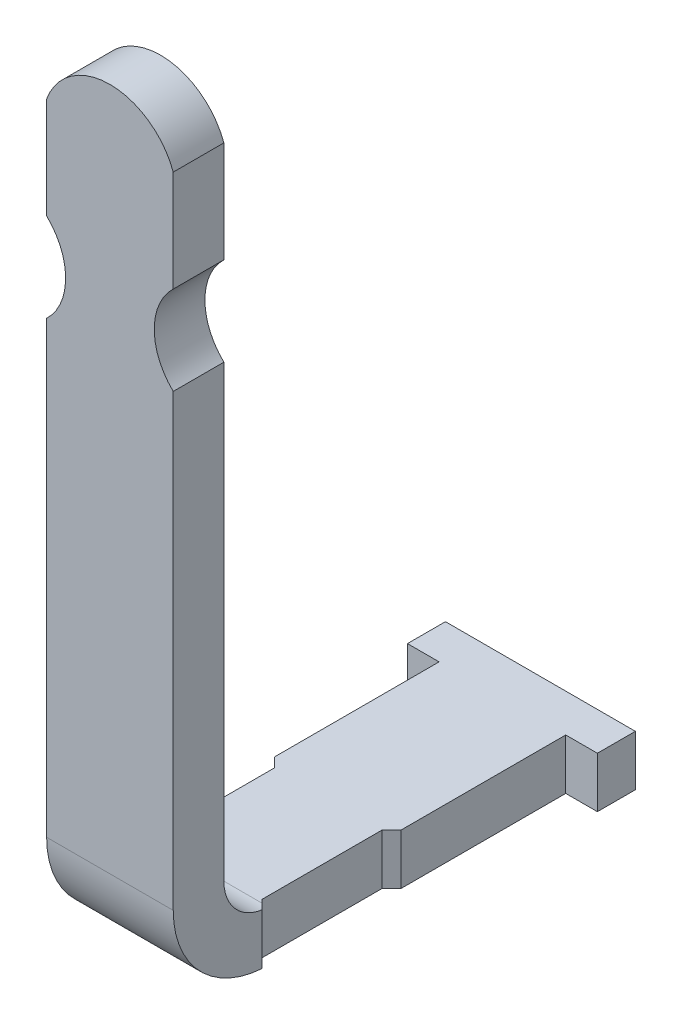
ISO-10303-21;
HEADER;
FILE_DESCRIPTION(('STEP AP214'),'2;1');
FILE_NAME('part.step','',(''),(''),'','','');
FILE_SCHEMA(('AUTOMOTIVE_DESIGN { 1 0 10303 214 1 1 1 1 }'));
ENDSEC;
DATA;
#1=APPLICATION_CONTEXT('core data for automotive mechanical design processes');
#2=APPLICATION_PROTOCOL_DEFINITION('international standard','automotive_design',2000,#1);
#3=PRODUCT_CONTEXT('',#1,'mechanical');
#4=PRODUCT('Part','Part','',(#3));
#5=PRODUCT_RELATED_PRODUCT_CATEGORY('part','',(#4));
#6=PRODUCT_DEFINITION_FORMATION('','',#4);
#7=PRODUCT_DEFINITION_CONTEXT('part definition',#1,'design');
#8=PRODUCT_DEFINITION('design','',#6,#7);
#9=PRODUCT_DEFINITION_SHAPE('','',#8);
#10=(LENGTH_UNIT() NAMED_UNIT(*) SI_UNIT(.MILLI.,.METRE.));
#11=(NAMED_UNIT(*) PLANE_ANGLE_UNIT() SI_UNIT($,.RADIAN.));
#12=(NAMED_UNIT(*) SI_UNIT($,.STERADIAN.) SOLID_ANGLE_UNIT());
#13=UNCERTAINTY_MEASURE_WITH_UNIT(LENGTH_MEASURE(1.E-05),#10,'distance_accuracy_value','');
#14=(GEOMETRIC_REPRESENTATION_CONTEXT(3) GLOBAL_UNCERTAINTY_ASSIGNED_CONTEXT((#13)) GLOBAL_UNIT_ASSIGNED_CONTEXT((#10,
#11,#12)) REPRESENTATION_CONTEXT('',''));
#15=CARTESIAN_POINT('',(0.,0.,0.));
#16=DIRECTION('',(0.,0.,1.));
#17=DIRECTION('',(1.,0.,0.));
#18=AXIS2_PLACEMENT_3D('',#15,#16,#17);
#19=CARTESIAN_POINT('',(0.425,-0.2,1.675));
#20=DIRECTION('',(0.707106781186548,0.,0.707106781186548));
#21=DIRECTION('',(0.707106781186548,0.,-0.707106781186548));
#22=AXIS2_PLACEMENT_3D('',#19,#20,#21);
#23=PLANE('',#22);
#24=DIRECTION('',(-0.707106781186548,0.,0.707106781186547));
#25=VECTOR('',#24,1.);
#26=CARTESIAN_POINT('',(0.5,-0.2,1.6));
#27=LINE('',#26,#25);
#28=CARTESIAN_POINT('',(0.5,-0.2,1.6));
#29=VERTEX_POINT('',#28);
#30=CARTESIAN_POINT('',(0.425,-0.2,1.675));
#31=VERTEX_POINT('',#30);
#32=EDGE_CURVE('E193',#29,#31,#27,.T.);
#33=ORIENTED_EDGE('',*,*,#32,.F.);
#34=DIRECTION('',(0.,1.,0.));
#35=VECTOR('',#34,1.);
#36=CARTESIAN_POINT('',(0.5,-0.2,1.6));
#37=LINE('',#36,#35);
#38=CARTESIAN_POINT('',(0.5,0.2,1.6));
#39=VERTEX_POINT('',#38);
#40=EDGE_CURVE('E188',#39,#29,#37,.F.);
#41=ORIENTED_EDGE('',*,*,#40,.F.);
#42=DIRECTION('',(0.707106781186548,0.,-0.707106781186547));
#43=VECTOR('',#42,1.);
#44=CARTESIAN_POINT('',(0.425,0.2,1.675));
#45=LINE('',#44,#43);
#46=CARTESIAN_POINT('',(0.425,0.200000000124333,1.675));
#47=VERTEX_POINT('',#46);
#48=EDGE_CURVE('E191',#47,#39,#45,.T.);
#49=ORIENTED_EDGE('',*,*,#48,.F.);
#50=DIRECTION('',(0.,1.,0.));
#51=VECTOR('',#50,1.);
#52=CARTESIAN_POINT('',(0.425,-0.2,1.675));
#53=LINE('',#52,#51);
#54=EDGE_CURVE('E216',#31,#47,#53,.T.);
#55=ORIENTED_EDGE('',*,*,#54,.F.);
#56=EDGE_LOOP('',(#33,#41,#49,#55));
#57=FACE_BOUND('',#56,.T.);
#58=ADVANCED_FACE('F24',(#57),#23,.T.);
#59=CARTESIAN_POINT('',(0.5,-0.2,1.6));
#60=DIRECTION('',(1.,0.,0.));
#61=DIRECTION('',(0.,0.,-1.));
#62=AXIS2_PLACEMENT_3D('',#59,#60,#61);
#63=PLANE('',#62);
#64=DIRECTION('',(0.,0.,-1.));
#65=VECTOR('',#64,1.);
#66=CARTESIAN_POINT('',(0.5,-0.2,2.65));
#67=LINE('',#66,#65);
#68=CARTESIAN_POINT('',(0.5,-0.2,0.3));
#69=VERTEX_POINT('',#68);
#70=EDGE_CURVE('E230',#69,#29,#67,.F.);
#71=ORIENTED_EDGE('',*,*,#70,.F.);
#72=DIRECTION('',(0.,1.,0.));
#73=VECTOR('',#72,1.);
#74=CARTESIAN_POINT('',(0.5,-0.2,0.3));
#75=LINE('',#74,#73);
#76=CARTESIAN_POINT('',(0.5,0.2,0.299999999503333));
#77=VERTEX_POINT('',#76);
#78=EDGE_CURVE('E197',#77,#69,#75,.F.);
#79=ORIENTED_EDGE('',*,*,#78,.F.);
#80=DIRECTION('',(0.,0.,1.));
#81=VECTOR('',#80,1.);
#82=CARTESIAN_POINT('',(0.5,0.2,0.));
#83=LINE('',#82,#81);
#84=EDGE_CURVE('E200',#39,#77,#83,.F.);
#85=ORIENTED_EDGE('',*,*,#84,.F.);
#86=ORIENTED_EDGE('',*,*,#40,.T.);
#87=EDGE_LOOP('',(#71,#79,#85,#86));
#88=FACE_BOUND('',#87,.T.);
#89=ADVANCED_FACE('F201',(#88),#63,.T.);
#90=CARTESIAN_POINT('',(0.5,-0.2,0.3));
#91=DIRECTION('',(0.,0.,1.));
#92=DIRECTION('',(1.,0.,0.));
#93=AXIS2_PLACEMENT_3D('',#90,#91,#92);
#94=PLANE('',#93);
#95=DIRECTION('',(1.,0.,0.));
#96=VECTOR('',#95,1.);
#97=CARTESIAN_POINT('',(0.,-0.2,0.3));
#98=LINE('',#97,#96);
#99=CARTESIAN_POINT('',(0.75,-0.2,0.3));
#100=VERTEX_POINT('',#99);
#101=EDGE_CURVE('E234',#100,#69,#98,.F.);
#102=ORIENTED_EDGE('',*,*,#101,.F.);
#103=DIRECTION('',(0.,1.,0.));
#104=VECTOR('',#103,1.);
#105=CARTESIAN_POINT('',(0.75,2.07074033906,0.3));
#106=LINE('',#105,#104);
#107=CARTESIAN_POINT('',(0.75,0.2,0.299999999503333));
#108=VERTEX_POINT('',#107);
#109=EDGE_CURVE('E391',#108,#100,#106,.F.);
#110=ORIENTED_EDGE('',*,*,#109,.F.);
#111=DIRECTION('',(1.,0.,0.));
#112=VECTOR('',#111,1.);
#113=CARTESIAN_POINT('',(0.,0.2,0.299999999255));
#114=LINE('',#113,#112);
#115=EDGE_CURVE('E205',#77,#108,#114,.T.);
#116=ORIENTED_EDGE('',*,*,#115,.F.);
#117=ORIENTED_EDGE('',*,*,#78,.T.);
#118=EDGE_LOOP('',(#102,#110,#116,#117));
#119=FACE_BOUND('',#118,.T.);
#120=ADVANCED_FACE('F410',(#119),#94,.T.);
#121=CARTESIAN_POINT('',(0.75,2.07074033906,2.57257875703));
#122=DIRECTION('',(1.,0.,0.));
#123=DIRECTION('',(0.,0.,-1.));
#124=AXIS2_PLACEMENT_3D('',#121,#122,#123);
#125=PLANE('',#124);
#126=DIRECTION('',(0.,1.,0.));
#127=VECTOR('',#126,1.);
#128=CARTESIAN_POINT('',(0.75,-0.2,0.));
#129=LINE('',#128,#127);
#130=CARTESIAN_POINT('',(0.75,0.2,0.));
#131=VERTEX_POINT('',#130);
#132=CARTESIAN_POINT('',(0.75,-0.2,-2.48352842920537E-10));
#133=VERTEX_POINT('',#132);
#134=EDGE_CURVE('E382',#131,#133,#129,.F.);
#135=ORIENTED_EDGE('',*,*,#134,.F.);
#136=DIRECTION('',(0.,0.,1.));
#137=VECTOR('',#136,1.);
#138=CARTESIAN_POINT('',(0.75,0.2,0.));
#139=LINE('',#138,#137);
#140=EDGE_CURVE('E387',#108,#131,#139,.F.);
#141=ORIENTED_EDGE('',*,*,#140,.F.);
#142=ORIENTED_EDGE('',*,*,#109,.T.);
#143=DIRECTION('',(0.,0.,-1.));
#144=VECTOR('',#143,1.);
#145=CARTESIAN_POINT('',(0.75,-0.2,2.65));
#146=LINE('',#145,#144);
#147=EDGE_CURVE('E239',#133,#100,#146,.F.);
#148=ORIENTED_EDGE('',*,*,#147,.F.);
#149=EDGE_LOOP('',(#135,#141,#142,#148));
#150=FACE_BOUND('',#149,.T.);
#151=ADVANCED_FACE('F416',(#150),#125,.T.);
#152=CARTESIAN_POINT('',(0.,-0.2,0.));
#153=DIRECTION('',(0.,0.,-1.));
#154=DIRECTION('',(-1.,0.,0.));
#155=AXIS2_PLACEMENT_3D('',#152,#153,#154);
#156=PLANE('',#155);
#157=DIRECTION('',(1.,0.,0.));
#158=VECTOR('',#157,1.);
#159=CARTESIAN_POINT('',(0.,-0.2,-3.72529264380805E-10));
#160=LINE('',#159,#158);
#161=CARTESIAN_POINT('',(-0.75,-0.2,-3.10441053650671E-10));
#162=VERTEX_POINT('',#161);
#163=EDGE_CURVE('E244',#162,#133,#160,.T.);
#164=ORIENTED_EDGE('',*,*,#163,.F.);
#165=DIRECTION('',(0.,1.,0.));
#166=VECTOR('',#165,1.);
#167=CARTESIAN_POINT('',(-0.75,2.07074033906,-3.72529264380805E-10));
#168=LINE('',#167,#166);
#169=CARTESIAN_POINT('',(-0.75,0.2,-1.24176421460268E-10));
#170=VERTEX_POINT('',#169);
#171=EDGE_CURVE('E373',#162,#170,#168,.T.);
#172=ORIENTED_EDGE('',*,*,#171,.T.);
#173=DIRECTION('',(1.,0.,0.));
#174=VECTOR('',#173,1.);
#175=CARTESIAN_POINT('',(0.,0.2,0.));
#176=LINE('',#175,#174);
#177=EDGE_CURVE('E378',#131,#170,#176,.F.);
#178=ORIENTED_EDGE('',*,*,#177,.F.);
#179=ORIENTED_EDGE('',*,*,#134,.T.);
#180=EDGE_LOOP('',(#164,#172,#178,#179));
#181=FACE_BOUND('',#180,.T.);
#182=ADVANCED_FACE('F421',(#181),#156,.T.);
#183=CARTESIAN_POINT('',(-0.75,2.07074033906,2.57257875703));
#184=DIRECTION('',(1.,0.,0.));
#185=DIRECTION('',(0.,0.,-1.));
#186=AXIS2_PLACEMENT_3D('',#183,#184,#185);
#187=PLANE('',#186);
#188=DIRECTION('',(0.,0.,1.));
#189=VECTOR('',#188,1.);
#190=CARTESIAN_POINT('',(-0.75,0.2,0.));
#191=LINE('',#190,#189);
#192=CARTESIAN_POINT('',(-0.75,0.2,0.300000000496667));
#193=VERTEX_POINT('',#192);
#194=EDGE_CURVE('E369',#170,#193,#191,.T.);
#195=ORIENTED_EDGE('',*,*,#194,.F.);
#196=ORIENTED_EDGE('',*,*,#171,.F.);
#197=DIRECTION('',(0.,0.,-1.));
#198=VECTOR('',#197,1.);
#199=CARTESIAN_POINT('',(-0.75,-0.2,2.65));
#200=LINE('',#199,#198);
#201=CARTESIAN_POINT('',(-0.75,-0.2,0.299999999503333));
#202=VERTEX_POINT('',#201);
#203=EDGE_CURVE('E249',#202,#162,#200,.T.);
#204=ORIENTED_EDGE('',*,*,#203,.F.);
#205=DIRECTION('',(0.,1.,0.));
#206=VECTOR('',#205,1.);
#207=CARTESIAN_POINT('',(-0.75,-0.2,0.3));
#208=LINE('',#207,#206);
#209=EDGE_CURVE('E364',#202,#193,#208,.T.);
#210=ORIENTED_EDGE('',*,*,#209,.T.);
#211=EDGE_LOOP('',(#195,#196,#204,#210));
#212=FACE_BOUND('',#211,.T.);
#213=ADVANCED_FACE('F424',(#212),#187,.F.);
#214=CARTESIAN_POINT('',(-0.5,-0.2,0.3));
#215=DIRECTION('',(0.,0.,-1.));
#216=DIRECTION('',(-1.,0.,0.));
#217=AXIS2_PLACEMENT_3D('',#214,#215,#216);
#218=PLANE('',#217);
#219=ORIENTED_EDGE('',*,*,#209,.F.);
#220=DIRECTION('',(1.,0.,0.));
#221=VECTOR('',#220,1.);
#222=CARTESIAN_POINT('',(0.,-0.2,0.299999999255));
#223=LINE('',#222,#221);
#224=CARTESIAN_POINT('',(-0.5,-0.2,0.299999999379166));
#225=VERTEX_POINT('',#224);
#226=EDGE_CURVE('E254',#225,#202,#223,.F.);
#227=ORIENTED_EDGE('',*,*,#226,.F.);
#228=DIRECTION('',(0.,1.,0.));
#229=VECTOR('',#228,1.);
#230=CARTESIAN_POINT('',(-0.5,-0.2,0.299999999255));
#231=LINE('',#230,#229);
#232=CARTESIAN_POINT('',(-0.5,0.2,0.300000000248333));
#233=VERTEX_POINT('',#232);
#234=EDGE_CURVE('E355',#225,#233,#231,.T.);
#235=ORIENTED_EDGE('',*,*,#234,.T.);
#236=DIRECTION('',(1.,0.,0.));
#237=VECTOR('',#236,1.);
#238=CARTESIAN_POINT('',(0.,0.2,0.300000000745));
#239=LINE('',#238,#237);
#240=EDGE_CURVE('E360',#193,#233,#239,.T.);
#241=ORIENTED_EDGE('',*,*,#240,.F.);
#242=EDGE_LOOP('',(#219,#227,#235,#241));
#243=FACE_BOUND('',#242,.T.);
#244=ADVANCED_FACE('F428',(#243),#218,.F.);
#245=CARTESIAN_POINT('',(-0.5,-0.2,1.6));
#246=DIRECTION('',(1.,0.,0.));
#247=DIRECTION('',(0.,0.,-1.));
#248=AXIS2_PLACEMENT_3D('',#245,#246,#247);
#249=PLANE('',#248);
#250=ORIENTED_EDGE('',*,*,#234,.F.);
#251=DIRECTION('',(0.,0.,-1.));
#252=VECTOR('',#251,1.);
#253=CARTESIAN_POINT('',(-0.5,-0.2,2.65));
#254=LINE('',#253,#252);
#255=CARTESIAN_POINT('',(-0.5,-0.2,1.6));
#256=VERTEX_POINT('',#255);
#257=EDGE_CURVE('E225',#256,#225,#254,.T.);
#258=ORIENTED_EDGE('',*,*,#257,.F.);
#259=DIRECTION('',(0.,1.,0.));
#260=VECTOR('',#259,1.);
#261=CARTESIAN_POINT('',(-0.5,-0.2,1.6));
#262=LINE('',#261,#260);
#263=CARTESIAN_POINT('',(-0.5,0.2,1.59999999975333));
#264=VERTEX_POINT('',#263);
#265=EDGE_CURVE('E219',#256,#264,#262,.T.);
#266=ORIENTED_EDGE('',*,*,#265,.T.);
#267=DIRECTION('',(0.,0.,1.));
#268=VECTOR('',#267,1.);
#269=CARTESIAN_POINT('',(-0.5,0.2,0.));
#270=LINE('',#269,#268);
#271=EDGE_CURVE('E351',#233,#264,#270,.T.);
#272=ORIENTED_EDGE('',*,*,#271,.F.);
#273=EDGE_LOOP('',(#250,#258,#266,#272));
#274=FACE_BOUND('',#273,.T.);
#275=ADVANCED_FACE('F433',(#274),#249,.F.);
#276=CARTESIAN_POINT('',(-0.425,-0.2,1.675));
#277=DIRECTION('',(0.707106781186548,0.,-0.707106781186548));
#278=DIRECTION('',(-0.707106781186548,0.,-0.707106781186548));
#279=AXIS2_PLACEMENT_3D('',#276,#277,#278);
#280=PLANE('',#279);
#281=ORIENTED_EDGE('',*,*,#265,.F.);
#282=DIRECTION('',(-0.707106781186548,0.,-0.707106781186547));
#283=VECTOR('',#282,1.);
#284=CARTESIAN_POINT('',(-0.425,-0.2,1.675));
#285=LINE('',#284,#283);
#286=CARTESIAN_POINT('',(-0.425,-0.2,1.675));
#287=VERTEX_POINT('',#286);
#288=EDGE_CURVE('E222',#287,#256,#285,.T.);
#289=ORIENTED_EDGE('',*,*,#288,.F.);
#290=DIRECTION('',(0.,1.,0.));
#291=VECTOR('',#290,1.);
#292=CARTESIAN_POINT('',(-0.425,-0.2,1.675));
#293=LINE('',#292,#291);
#294=CARTESIAN_POINT('',(-0.425000000496667,0.2,1.6750000005));
#295=VERTEX_POINT('',#294);
#296=EDGE_CURVE('E209',#287,#295,#293,.T.);
#297=ORIENTED_EDGE('',*,*,#296,.T.);
#298=DIRECTION('',(0.707106772394853,0.,0.707106789978242));
#299=VECTOR('',#298,1.);
#300=CARTESIAN_POINT('',(-0.5,0.2,1.59999999963));
#301=LINE('',#300,#299);
#302=EDGE_CURVE('E348',#264,#295,#301,.T.);
#303=ORIENTED_EDGE('',*,*,#302,.F.);
#304=EDGE_LOOP('',(#281,#289,#297,#303));
#305=FACE_BOUND('',#304,.T.);
#306=ADVANCED_FACE('F436',(#305),#280,.F.);
#307=CARTESIAN_POINT('',(0.425,-0.2,2.625));
#308=DIRECTION('',(1.,0.,0.));
#309=DIRECTION('',(0.,0.,-1.));
#310=AXIS2_PLACEMENT_3D('',#307,#308,#309);
#311=PLANE('',#310);
#312=DIRECTION('',(0.,0.,-1.));
#313=VECTOR('',#312,1.);
#314=CARTESIAN_POINT('',(0.425,-0.2,2.65));
#315=LINE('',#314,#313);
#316=CARTESIAN_POINT('',(0.425,-0.2,2.625));
#317=VERTEX_POINT('',#316);
#318=EDGE_CURVE('E229',#31,#317,#315,.F.);
#319=ORIENTED_EDGE('',*,*,#318,.F.);
#320=ORIENTED_EDGE('',*,*,#54,.T.);
#321=DIRECTION('',(0.,0.,1.));
#322=VECTOR('',#321,1.);
#323=CARTESIAN_POINT('',(0.425,0.2,0.));
#324=LINE('',#323,#322);
#325=CARTESIAN_POINT('',(0.425,0.200000000248667,2.625));
#326=VERTEX_POINT('',#325);
#327=EDGE_CURVE('E120',#326,#47,#324,.F.);
#328=ORIENTED_EDGE('',*,*,#327,.F.);
#329=DIRECTION('',(0.,1.,0.));
#330=VECTOR('',#329,1.);
#331=CARTESIAN_POINT('',(0.425,-0.2,2.625));
#332=LINE('',#331,#330);
#333=EDGE_CURVE('E327',#317,#326,#332,.T.);
#334=ORIENTED_EDGE('',*,*,#333,.F.);
#335=EDGE_LOOP('',(#319,#320,#328,#334));
#336=FACE_BOUND('',#335,.T.);
#337=ADVANCED_FACE('F660',(#336),#311,.T.);
#338=CARTESIAN_POINT('',(0.,-0.2,2.65));
#339=DIRECTION('',(0.,-1.,0.));
#340=DIRECTION('',(0.,0.,-1.));
#341=AXIS2_PLACEMENT_3D('',#338,#339,#340);
#342=PLANE('',#341);
#343=ORIENTED_EDGE('',*,*,#32,.T.);
#344=ORIENTED_EDGE('',*,*,#318,.T.);
#345=DIRECTION('',(-0.707106781186548,0.,-0.707106781186548));
#346=VECTOR('',#345,1.);
#347=CARTESIAN_POINT('',(0.5,-0.2,2.7));
#348=LINE('',#347,#346);
#349=CARTESIAN_POINT('',(0.450000000165,-0.2,2.650000000165));
#350=VERTEX_POINT('',#349);
#351=EDGE_CURVE('E324',#350,#317,#348,.T.);
#352=ORIENTED_EDGE('',*,*,#351,.F.);
#353=DIRECTION('',(1.,0.,0.));
#354=VECTOR('',#353,1.);
#355=CARTESIAN_POINT('',(0.,-0.2,2.65000000033));
#356=LINE('',#355,#354);
#357=CARTESIAN_POINT('',(-0.450000000165,-0.2,2.650000000165));
#358=VERTEX_POINT('',#357);
#359=EDGE_CURVE('E309',#358,#350,#356,.T.);
#360=ORIENTED_EDGE('',*,*,#359,.F.);
#361=DIRECTION('',(0.707106781172409,0.,-0.707106781200686));
#362=VECTOR('',#361,1.);
#363=CARTESIAN_POINT('',(-0.450000000329,-0.2,2.65000000033));
#364=LINE('',#363,#362);
#365=CARTESIAN_POINT('',(-0.425,-0.2,2.625));
#366=VERTEX_POINT('',#365);
#367=EDGE_CURVE('E218',#358,#366,#364,.T.);
#368=ORIENTED_EDGE('',*,*,#367,.T.);
#369=DIRECTION('',(0.,0.,-1.));
#370=VECTOR('',#369,1.);
#371=CARTESIAN_POINT('',(-0.425,-0.2,2.625));
#372=LINE('',#371,#370);
#373=EDGE_CURVE('E342',#366,#287,#372,.T.);
#374=ORIENTED_EDGE('',*,*,#373,.T.);
#375=ORIENTED_EDGE('',*,*,#288,.T.);
#376=ORIENTED_EDGE('',*,*,#257,.T.);
#377=ORIENTED_EDGE('',*,*,#226,.T.);
#378=ORIENTED_EDGE('',*,*,#203,.T.);
#379=ORIENTED_EDGE('',*,*,#163,.T.);
#380=ORIENTED_EDGE('',*,*,#147,.T.);
#381=ORIENTED_EDGE('',*,*,#101,.T.);
#382=ORIENTED_EDGE('',*,*,#70,.T.);
#383=EDGE_LOOP('',(#343,#344,#352,#360,#368,#374,#375,#376,#377,#378,#379,#380,#381,#382));
#384=FACE_BOUND('',#383,.T.);
#385=ADVANCED_FACE('F412',(#384),#342,.T.);
#386=CARTESIAN_POINT('',(-0.425,-0.2,2.625));
#387=DIRECTION('',(1.,0.,0.));
#388=DIRECTION('',(0.,0.,-1.));
#389=AXIS2_PLACEMENT_3D('',#386,#387,#388);
#390=PLANE('',#389);
#391=ORIENTED_EDGE('',*,*,#296,.F.);
#392=ORIENTED_EDGE('',*,*,#373,.F.);
#393=DIRECTION('',(0.,1.,0.));
#394=VECTOR('',#393,1.);
#395=CARTESIAN_POINT('',(-0.425,-0.2,2.625));
#396=LINE('',#395,#394);
#397=CARTESIAN_POINT('',(-0.425000000248333,0.2,2.625));
#398=VERTEX_POINT('',#397);
#399=EDGE_CURVE('E307',#366,#398,#396,.T.);
#400=ORIENTED_EDGE('',*,*,#399,.T.);
#401=DIRECTION('',(0.,0.,1.));
#402=VECTOR('',#401,1.);
#403=CARTESIAN_POINT('',(-0.425000000745,0.2,0.));
#404=LINE('',#403,#402);
#405=EDGE_CURVE('E328',#295,#398,#404,.T.);
#406=ORIENTED_EDGE('',*,*,#405,.F.);
#407=EDGE_LOOP('',(#391,#392,#400,#406));
#408=FACE_BOUND('',#407,.T.);
#409=ADVANCED_FACE('F443',(#408),#390,.F.);
#410=CARTESIAN_POINT('',(0.,0.2,0.));
#411=DIRECTION('',(0.,1.,0.));
#412=DIRECTION('',(0.,0.,1.));
#413=AXIS2_PLACEMENT_3D('',#410,#411,#412);
#414=PLANE('',#413);
#415=DIRECTION('',(0.707106781186548,0.,-0.707106781186548));
#416=VECTOR('',#415,1.);
#417=CARTESIAN_POINT('',(-0.5,0.2,2.7));
#418=LINE('',#417,#416);
#419=CARTESIAN_POINT('',(-0.45,0.2,2.65));
#420=VERTEX_POINT('',#419);
#421=EDGE_CURVE('E304',#398,#420,#418,.F.);
#422=ORIENTED_EDGE('',*,*,#421,.T.);
#423=DIRECTION('',(1.,0.,0.));
#424=VECTOR('',#423,1.);
#425=CARTESIAN_POINT('',(0.,0.2,2.65));
#426=LINE('',#425,#424);
#427=CARTESIAN_POINT('',(0.45,0.20000000009325,2.65));
#428=VERTEX_POINT('',#427);
#429=EDGE_CURVE('E288',#420,#428,#426,.T.);
#430=ORIENTED_EDGE('',*,*,#429,.T.);
#431=DIRECTION('',(-0.707106781186548,0.,-0.707106781186548));
#432=VECTOR('',#431,1.);
#433=CARTESIAN_POINT('',(0.5,0.200000000373,2.7));
#434=LINE('',#433,#432);
#435=EDGE_CURVE('E338',#326,#428,#434,.F.);
#436=ORIENTED_EDGE('',*,*,#435,.F.);
#437=ORIENTED_EDGE('',*,*,#327,.T.);
#438=ORIENTED_EDGE('',*,*,#48,.T.);
#439=ORIENTED_EDGE('',*,*,#84,.T.);
#440=ORIENTED_EDGE('',*,*,#115,.T.);
#441=ORIENTED_EDGE('',*,*,#140,.T.);
#442=ORIENTED_EDGE('',*,*,#177,.T.);
#443=ORIENTED_EDGE('',*,*,#194,.T.);
#444=ORIENTED_EDGE('',*,*,#240,.T.);
#445=ORIENTED_EDGE('',*,*,#271,.T.);
#446=ORIENTED_EDGE('',*,*,#302,.T.);
#447=ORIENTED_EDGE('',*,*,#405,.T.);
#448=EDGE_LOOP('',(#422,#430,#436,#437,#438,#439,#440,#441,#442,#443,#444,#445,#446,#447));
#449=FACE_BOUND('',#448,.T.);
#450=ADVANCED_FACE('F207',(#449),#414,.T.);
#451=CARTESIAN_POINT('',(0.5,-0.2,2.7));
#452=DIRECTION('',(0.707106781186548,0.,-0.707106781186548));
#453=DIRECTION('',(-0.707106781186548,0.,-0.707106781186548));
#454=AXIS2_PLACEMENT_3D('',#451,#452,#453);
#455=PLANE('',#454);
#456=ORIENTED_EDGE('',*,*,#333,.T.);
#457=ORIENTED_EDGE('',*,*,#435,.T.);
#458=CARTESIAN_POINT('',(0.45,0.55,2.65));
#459=DIRECTION('',(0.707106781186548,0.,-0.707106781186548));
#460=DIRECTION('',(0.707106781186548,0.,0.707106781186548));
#461=AXIS2_PLACEMENT_3D('',#458,#459,#460);
#462=ELLIPSE('',#461,0.494974746830583,0.35);
#463=CARTESIAN_POINT('',(0.5,0.203589838486224,2.7));
#464=VERTEX_POINT('',#463);
#465=EDGE_CURVE('E286',#428,#464,#462,.F.);
#466=ORIENTED_EDGE('',*,*,#465,.T.);
#467=DIRECTION('',(0.,1.,0.));
#468=VECTOR('',#467,1.);
#469=CARTESIAN_POINT('',(0.5,-0.2,2.7));
#470=LINE('',#469,#468);
#471=CARTESIAN_POINT('',(0.5,-0.198331477354788,2.7));
#472=VERTEX_POINT('',#471);
#473=EDGE_CURVE('E292',#472,#464,#470,.T.);
#474=ORIENTED_EDGE('',*,*,#473,.F.);
#475=CARTESIAN_POINT('',(0.45,0.55,2.65));
#476=DIRECTION('',(0.707106781186548,0.,-0.707106781186548));
#477=DIRECTION('',(0.707106781186548,0.,0.707106781186548));
#478=AXIS2_PLACEMENT_3D('',#475,#476,#477);
#479=ELLIPSE('',#478,1.06066017177982,0.75);
#480=EDGE_CURVE('E308',#350,#472,#479,.F.);
#481=ORIENTED_EDGE('',*,*,#480,.F.);
#482=ORIENTED_EDGE('',*,*,#351,.T.);
#483=EDGE_LOOP('',(#456,#457,#466,#474,#481,#482));
#484=FACE_BOUND('',#483,.T.);
#485=ADVANCED_FACE('F474',(#484),#455,.T.);
#486=CARTESIAN_POINT('',(0.,5.95,3.4));
#487=DIRECTION('',(0.,0.,1.));
#488=DIRECTION('',(1.,0.,0.));
#489=AXIS2_PLACEMENT_3D('',#486,#487,#488);
#490=PLANE('',#489);
#491=CARTESIAN_POINT('',(0.833333333333,4.45,3.4));
#492=DIRECTION('',(0.,0.,-1.));
#493=DIRECTION('',(-1.,0.,0.));
#494=AXIS2_PLACEMENT_3D('',#491,#492,#493);
#495=CIRCLE('',#494,0.483333333333);
#496=CARTESIAN_POINT('',(0.5,4.10000000000007,3.4));
#497=VERTEX_POINT('',#496);
#498=CARTESIAN_POINT('',(0.500000000000036,4.79999999999989,3.4));
#499=VERTEX_POINT('',#498);
#500=EDGE_CURVE('E297',#497,#499,#495,.T.);
#501=ORIENTED_EDGE('',*,*,#500,.T.);
#502=DIRECTION('',(0.,1.,0.));
#503=VECTOR('',#502,1.);
#504=CARTESIAN_POINT('',(0.5,-0.2,3.4));
#505=LINE('',#504,#503);
#506=CARTESIAN_POINT('',(0.5,5.60000000000164,3.4));
#507=VERTEX_POINT('',#506);
#508=EDGE_CURVE('E300',#507,#499,#505,.F.);
#509=ORIENTED_EDGE('',*,*,#508,.F.);
#510=CARTESIAN_POINT('',(0.,5.41785714286,3.4));
#511=DIRECTION('',(0.,0.,-1.));
#512=DIRECTION('',(-1.,0.,0.));
#513=AXIS2_PLACEMENT_3D('',#510,#511,#512);
#514=CIRCLE('',#513,0.532142857143);
#515=CARTESIAN_POINT('',(-0.5,5.60000000000164,3.4));
#516=VERTEX_POINT('',#515);
#517=EDGE_CURVE('E301',#516,#507,#514,.T.);
#518=ORIENTED_EDGE('',*,*,#517,.F.);
#519=DIRECTION('',(0.,1.,0.));
#520=VECTOR('',#519,1.);
#521=CARTESIAN_POINT('',(-0.5,5.95,3.4));
#522=LINE('',#521,#520);
#523=CARTESIAN_POINT('',(-0.5,4.79999999999993,3.4));
#524=VERTEX_POINT('',#523);
#525=EDGE_CURVE('E465',#516,#524,#522,.F.);
#526=ORIENTED_EDGE('',*,*,#525,.T.);
#527=CARTESIAN_POINT('',(-0.833333333333,4.45,3.4));
#528=DIRECTION('',(0.,0.,-1.));
#529=DIRECTION('',(-1.,0.,0.));
#530=AXIS2_PLACEMENT_3D('',#527,#528,#529);
#531=CIRCLE('',#530,0.483333333333);
#532=CARTESIAN_POINT('',(-0.500000000000036,4.10000000000011,3.4));
#533=VERTEX_POINT('',#532);
#534=EDGE_CURVE('E27',#524,#533,#531,.T.);
#535=ORIENTED_EDGE('',*,*,#534,.T.);
#536=DIRECTION('',(0.,1.,0.));
#537=VECTOR('',#536,1.);
#538=CARTESIAN_POINT('',(-0.5,-0.2,3.4));
#539=LINE('',#538,#537);
#540=CARTESIAN_POINT('',(-0.5,0.55,3.4));
#541=VERTEX_POINT('',#540);
#542=EDGE_CURVE('E283',#533,#541,#539,.F.);
#543=ORIENTED_EDGE('',*,*,#542,.T.);
#544=DIRECTION('',(1.,0.,0.));
#545=VECTOR('',#544,1.);
#546=CARTESIAN_POINT('',(0.,0.55,3.4));
#547=LINE('',#546,#545);
#548=CARTESIAN_POINT('',(0.5,0.55,3.4));
#549=VERTEX_POINT('',#548);
#550=EDGE_CURVE('E315',#549,#541,#547,.F.);
#551=ORIENTED_EDGE('',*,*,#550,.F.);
#552=DIRECTION('',(0.,1.,0.));
#553=VECTOR('',#552,1.);
#554=CARTESIAN_POINT('',(0.5,-0.2,3.4));
#555=LINE('',#554,#553);
#556=EDGE_CURVE('E296',#497,#549,#555,.F.);
#557=ORIENTED_EDGE('',*,*,#556,.F.);
#558=EDGE_LOOP('',(#501,#509,#518,#526,#535,#543,#551,#557));
#559=FACE_BOUND('',#558,.T.);
#560=ADVANCED_FACE('F516',(#559),#490,.T.);
#561=CARTESIAN_POINT('',(0.,0.55,2.65));
#562=DIRECTION('',(1.,0.,0.));
#563=DIRECTION('',(0.,0.,-1.));
#564=AXIS2_PLACEMENT_3D('',#561,#562,#563);
#565=CYLINDRICAL_SURFACE('',#564,0.75);
#566=ORIENTED_EDGE('',*,*,#359,.T.);
#567=ORIENTED_EDGE('',*,*,#480,.T.);
#568=CARTESIAN_POINT('',(0.5,0.55,2.65));
#569=DIRECTION('',(1.,0.,0.));
#570=DIRECTION('',(0.,0.,-1.));
#571=AXIS2_PLACEMENT_3D('',#568,#569,#570);
#572=CIRCLE('',#571,0.75);
#573=EDGE_CURVE('E293',#549,#472,#572,.T.);
#574=ORIENTED_EDGE('',*,*,#573,.F.);
#575=ORIENTED_EDGE('',*,*,#550,.T.);
#576=CARTESIAN_POINT('',(-0.5,0.55,2.65));
#577=DIRECTION('',(1.,0.,0.));
#578=DIRECTION('',(0.,0.,-1.));
#579=AXIS2_PLACEMENT_3D('',#576,#577,#578);
#580=CIRCLE('',#579,0.75);
#581=CARTESIAN_POINT('',(-0.5,-0.198331477351113,2.700000000055));
#582=VERTEX_POINT('',#581);
#583=EDGE_CURVE('E281',#541,#582,#580,.T.);
#584=ORIENTED_EDGE('',*,*,#583,.T.);
#585=CARTESIAN_POINT('',(-0.45,0.55,2.65));
#586=DIRECTION('',(0.707106781186548,0.,0.707106781186548));
#587=DIRECTION('',(0.707106781186548,0.,-0.707106781186548));
#588=AXIS2_PLACEMENT_3D('',#585,#586,#587);
#589=ELLIPSE('',#588,1.06066017177982,0.75);
#590=EDGE_CURVE('E305',#582,#358,#589,.T.);
#591=ORIENTED_EDGE('',*,*,#590,.T.);
#592=EDGE_LOOP('',(#566,#567,#574,#575,#584,#591));
#593=FACE_BOUND('',#592,.T.);
#594=ADVANCED_FACE('F520',(#593),#565,.T.);
#595=CARTESIAN_POINT('',(-0.5,-0.2,2.7));
#596=DIRECTION('',(0.707106781186548,0.,0.707106781186548));
#597=DIRECTION('',(0.707106781186548,0.,-0.707106781186548));
#598=AXIS2_PLACEMENT_3D('',#595,#596,#597);
#599=PLANE('',#598);
#600=ORIENTED_EDGE('',*,*,#421,.F.);
#601=ORIENTED_EDGE('',*,*,#399,.F.);
#602=ORIENTED_EDGE('',*,*,#367,.F.);
#603=ORIENTED_EDGE('',*,*,#590,.F.);
#604=DIRECTION('',(0.,1.,0.));
#605=VECTOR('',#604,1.);
#606=CARTESIAN_POINT('',(-0.5,-0.2,2.70000000011));
#607=LINE('',#606,#605);
#608=CARTESIAN_POINT('',(-0.5,0.203589838494163,2.700000000055));
#609=VERTEX_POINT('',#608);
#610=EDGE_CURVE('E280',#582,#609,#607,.T.);
#611=ORIENTED_EDGE('',*,*,#610,.T.);
#612=CARTESIAN_POINT('',(-0.45,0.55,2.65));
#613=DIRECTION('',(0.707106781186548,0.,0.707106781186548));
#614=DIRECTION('',(0.707106781186548,0.,-0.707106781186548));
#615=AXIS2_PLACEMENT_3D('',#612,#613,#614);
#616=ELLIPSE('',#615,0.494974746830583,0.35);
#617=EDGE_CURVE('E289',#609,#420,#616,.T.);
#618=ORIENTED_EDGE('',*,*,#617,.T.);
#619=EDGE_LOOP('',(#600,#601,#602,#603,#611,#618));
#620=FACE_BOUND('',#619,.T.);
#621=ADVANCED_FACE('F455',(#620),#599,.F.);
#622=CARTESIAN_POINT('',(0.,5.41785714286,3.4));
#623=DIRECTION('',(0.,0.,-1.));
#624=DIRECTION('',(-1.,0.,0.));
#625=AXIS2_PLACEMENT_3D('',#622,#623,#624);
#626=CYLINDRICAL_SURFACE('',#625,0.532142857143);
#627=ORIENTED_EDGE('',*,*,#517,.T.);
#628=DIRECTION('',(0.,0.,-1.));
#629=VECTOR('',#628,1.);
#630=CARTESIAN_POINT('',(0.5,5.6,3.62062019195));
#631=LINE('',#630,#629);
#632=CARTESIAN_POINT('',(0.5,5.60000000000164,2.999999999815));
#633=VERTEX_POINT('',#632);
#634=EDGE_CURVE('E303',#633,#507,#631,.F.);
#635=ORIENTED_EDGE('',*,*,#634,.F.);
#636=CARTESIAN_POINT('',(0.,5.41785714286,2.99999999963));
#637=DIRECTION('',(0.,0.,-1.));
#638=DIRECTION('',(-1.,0.,0.));
#639=AXIS2_PLACEMENT_3D('',#636,#637,#638);
#640=CIRCLE('',#639,0.532142857143);
#641=CARTESIAN_POINT('',(-0.5,5.60000000000164,2.999999999815));
#642=VERTEX_POINT('',#641);
#643=EDGE_CURVE('E273',#642,#633,#640,.T.);
#644=ORIENTED_EDGE('',*,*,#643,.F.);
#645=DIRECTION('',(0.,0.,-1.));
#646=VECTOR('',#645,1.);
#647=CARTESIAN_POINT('',(-0.5,5.6,3.62062019195));
#648=LINE('',#647,#646);
#649=EDGE_CURVE('E276',#642,#516,#648,.F.);
#650=ORIENTED_EDGE('',*,*,#649,.T.);
#651=EDGE_LOOP('',(#627,#635,#644,#650));
#652=FACE_BOUND('',#651,.T.);
#653=ADVANCED_FACE('F594',(#652),#626,.T.);
#654=CARTESIAN_POINT('',(0.5,-0.2,3.62062019195));
#655=DIRECTION('',(1.,0.,0.));
#656=DIRECTION('',(0.,0.,-1.));
#657=AXIS2_PLACEMENT_3D('',#654,#655,#656);
#658=PLANE('',#657);
#659=DIRECTION('',(0.,0.,-1.));
#660=VECTOR('',#659,1.);
#661=CARTESIAN_POINT('',(0.500000000000071,4.79999999999993,3.4));
#662=LINE('',#661,#660);
#663=CARTESIAN_POINT('',(0.500000000000018,4.79999999999989,2.999999999815));
#664=VERTEX_POINT('',#663);
#665=EDGE_CURVE('E299',#499,#664,#662,.T.);
#666=ORIENTED_EDGE('',*,*,#665,.T.);
#667=DIRECTION('',(0.,1.,0.));
#668=VECTOR('',#667,1.);
#669=CARTESIAN_POINT('',(0.5,0.55,3.));
#670=LINE('',#669,#668);
#671=EDGE_CURVE('E272',#633,#664,#670,.F.);
#672=ORIENTED_EDGE('',*,*,#671,.F.);
#673=ORIENTED_EDGE('',*,*,#634,.T.);
#674=ORIENTED_EDGE('',*,*,#508,.T.);
#675=EDGE_LOOP('',(#666,#672,#673,#674));
#676=FACE_BOUND('',#675,.T.);
#677=ADVANCED_FACE('F498',(#676),#658,.T.);
#678=CARTESIAN_POINT('',(0.833333333333,4.45,3.4));
#679=DIRECTION('',(0.,0.,-1.));
#680=DIRECTION('',(-1.,0.,0.));
#681=AXIS2_PLACEMENT_3D('',#678,#679,#680);
#682=CYLINDRICAL_SURFACE('',#681,0.483333333333);
#683=ORIENTED_EDGE('',*,*,#665,.F.);
#684=ORIENTED_EDGE('',*,*,#500,.F.);
#685=DIRECTION('',(0.,0.,-1.));
#686=VECTOR('',#685,1.);
#687=CARTESIAN_POINT('',(0.5,4.1,3.62062019195));
#688=LINE('',#687,#686);
#689=CARTESIAN_POINT('',(0.5,4.10000000000007,2.999999999815));
#690=VERTEX_POINT('',#689);
#691=EDGE_CURVE('E492',#690,#497,#688,.F.);
#692=ORIENTED_EDGE('',*,*,#691,.F.);
#693=CARTESIAN_POINT('',(0.833333333333,4.45,2.99999999963));
#694=DIRECTION('',(0.,0.,-1.));
#695=DIRECTION('',(-1.,0.,0.));
#696=AXIS2_PLACEMENT_3D('',#693,#694,#695);
#697=CIRCLE('',#696,0.483333333333);
#698=EDGE_CURVE('E268',#664,#690,#697,.F.);
#699=ORIENTED_EDGE('',*,*,#698,.F.);
#700=EDGE_LOOP('',(#683,#684,#692,#699));
#701=FACE_BOUND('',#700,.T.);
#702=ADVANCED_FACE('F503',(#701),#682,.F.);
#703=CARTESIAN_POINT('',(0.5,-0.2,3.62062019195));
#704=DIRECTION('',(1.,0.,0.));
#705=DIRECTION('',(0.,0.,-1.));
#706=AXIS2_PLACEMENT_3D('',#703,#704,#705);
#707=PLANE('',#706);
#708=CARTESIAN_POINT('',(0.5,0.55,2.65));
#709=DIRECTION('',(1.,0.,0.));
#710=DIRECTION('',(0.,0.,-1.));
#711=AXIS2_PLACEMENT_3D('',#708,#709,#710);
#712=CIRCLE('',#711,0.35);
#713=CARTESIAN_POINT('',(0.5,0.55,3.));
#714=VERTEX_POINT('',#713);
#715=EDGE_CURVE('E284',#464,#714,#712,.F.);
#716=ORIENTED_EDGE('',*,*,#715,.T.);
#717=DIRECTION('',(0.,1.,0.));
#718=VECTOR('',#717,1.);
#719=CARTESIAN_POINT('',(0.5,0.55,3.));
#720=LINE('',#719,#718);
#721=EDGE_CURVE('E271',#690,#714,#720,.F.);
#722=ORIENTED_EDGE('',*,*,#721,.F.);
#723=ORIENTED_EDGE('',*,*,#691,.T.);
#724=ORIENTED_EDGE('',*,*,#556,.T.);
#725=ORIENTED_EDGE('',*,*,#573,.T.);
#726=ORIENTED_EDGE('',*,*,#473,.T.);
#727=EDGE_LOOP('',(#716,#722,#723,#724,#725,#726));
#728=FACE_BOUND('',#727,.T.);
#729=ADVANCED_FACE('F484',(#728),#707,.T.);
#730=CARTESIAN_POINT('',(0.,0.55,2.65));
#731=DIRECTION('',(1.,0.,0.));
#732=DIRECTION('',(0.,0.,-1.));
#733=AXIS2_PLACEMENT_3D('',#730,#731,#732);
#734=CYLINDRICAL_SURFACE('',#733,0.35);
#735=ORIENTED_EDGE('',*,*,#465,.F.);
#736=ORIENTED_EDGE('',*,*,#429,.F.);
#737=ORIENTED_EDGE('',*,*,#617,.F.);
#738=CARTESIAN_POINT('',(-0.5,0.55,2.65));
#739=DIRECTION('',(1.,0.,0.));
#740=DIRECTION('',(0.,0.,-1.));
#741=AXIS2_PLACEMENT_3D('',#738,#739,#740);
#742=CIRCLE('',#741,0.35);
#743=CARTESIAN_POINT('',(-0.5,0.55,3.));
#744=VERTEX_POINT('',#743);
#745=EDGE_CURVE('E277',#609,#744,#742,.F.);
#746=ORIENTED_EDGE('',*,*,#745,.T.);
#747=DIRECTION('',(-1.,0.,0.));
#748=VECTOR('',#747,1.);
#749=CARTESIAN_POINT('',(0.,0.55,3.));
#750=LINE('',#749,#748);
#751=EDGE_CURVE('E480',#714,#744,#750,.T.);
#752=ORIENTED_EDGE('',*,*,#751,.F.);
#753=ORIENTED_EDGE('',*,*,#715,.F.);
#754=EDGE_LOOP('',(#735,#736,#737,#746,#752,#753));
#755=FACE_BOUND('',#754,.T.);
#756=ADVANCED_FACE('F477',(#755),#734,.F.);
#757=CARTESIAN_POINT('',(-0.5,-0.2,3.62062019195));
#758=DIRECTION('',(1.,0.,0.));
#759=DIRECTION('',(0.,0.,-1.));
#760=AXIS2_PLACEMENT_3D('',#757,#758,#759);
#761=PLANE('',#760);
#762=DIRECTION('',(0.,1.,0.));
#763=VECTOR('',#762,1.);
#764=CARTESIAN_POINT('',(-0.5,0.55,3.));
#765=LINE('',#764,#763);
#766=CARTESIAN_POINT('',(-0.500000000000018,4.10000000000011,2.999999999815));
#767=VERTEX_POINT('',#766);
#768=EDGE_CURVE('E267',#744,#767,#765,.T.);
#769=ORIENTED_EDGE('',*,*,#768,.F.);
#770=ORIENTED_EDGE('',*,*,#745,.F.);
#771=ORIENTED_EDGE('',*,*,#610,.F.);
#772=ORIENTED_EDGE('',*,*,#583,.F.);
#773=ORIENTED_EDGE('',*,*,#542,.F.);
#774=DIRECTION('',(0.,0.,-1.));
#775=VECTOR('',#774,1.);
#776=CARTESIAN_POINT('',(-0.500000000000071,4.10000000000008,3.4));
#777=LINE('',#776,#775);
#778=EDGE_CURVE('E279',#533,#767,#777,.T.);
#779=ORIENTED_EDGE('',*,*,#778,.T.);
#780=EDGE_LOOP('',(#769,#770,#771,#772,#773,#779));
#781=FACE_BOUND('',#780,.T.);
#782=ADVANCED_FACE('F523',(#781),#761,.F.);
#783=CARTESIAN_POINT('',(-0.833333333333,4.45,3.4));
#784=DIRECTION('',(0.,0.,-1.));
#785=DIRECTION('',(-1.,0.,0.));
#786=AXIS2_PLACEMENT_3D('',#783,#784,#785);
#787=CYLINDRICAL_SURFACE('',#786,0.483333333333);
#788=ORIENTED_EDGE('',*,*,#778,.F.);
#789=ORIENTED_EDGE('',*,*,#534,.F.);
#790=DIRECTION('',(0.,0.,-1.));
#791=VECTOR('',#790,1.);
#792=CARTESIAN_POINT('',(-0.5,4.8,3.62062019195));
#793=LINE('',#792,#791);
#794=CARTESIAN_POINT('',(-0.5,4.79999999999993,2.999999999815));
#795=VERTEX_POINT('',#794);
#796=EDGE_CURVE('E42',#524,#795,#793,.T.);
#797=ORIENTED_EDGE('',*,*,#796,.T.);
#798=CARTESIAN_POINT('',(-0.833333333333,4.45,2.99999999963));
#799=DIRECTION('',(0.,0.,-1.));
#800=DIRECTION('',(-1.,0.,0.));
#801=AXIS2_PLACEMENT_3D('',#798,#799,#800);
#802=CIRCLE('',#801,0.483333333333);
#803=EDGE_CURVE('E33',#767,#795,#802,.F.);
#804=ORIENTED_EDGE('',*,*,#803,.F.);
#805=EDGE_LOOP('',(#788,#789,#797,#804));
#806=FACE_BOUND('',#805,.T.);
#807=ADVANCED_FACE('F526',(#806),#787,.F.);
#808=CARTESIAN_POINT('',(-0.5,-0.2,3.62062019195));
#809=DIRECTION('',(1.,0.,0.));
#810=DIRECTION('',(0.,0.,-1.));
#811=AXIS2_PLACEMENT_3D('',#808,#809,#810);
#812=PLANE('',#811);
#813=DIRECTION('',(0.,1.,0.));
#814=VECTOR('',#813,1.);
#815=CARTESIAN_POINT('',(-0.5,0.55,3.));
#816=LINE('',#815,#814);
#817=EDGE_CURVE('E13',#795,#642,#816,.T.);
#818=ORIENTED_EDGE('',*,*,#817,.F.);
#819=ORIENTED_EDGE('',*,*,#796,.F.);
#820=ORIENTED_EDGE('',*,*,#525,.F.);
#821=ORIENTED_EDGE('',*,*,#649,.F.);
#822=EDGE_LOOP('',(#818,#819,#820,#821));
#823=FACE_BOUND('',#822,.T.);
#824=ADVANCED_FACE('F528',(#823),#812,.F.);
#825=CARTESIAN_POINT('',(0.,0.55,3.));
#826=DIRECTION('',(0.,0.,-1.));
#827=DIRECTION('',(-1.,0.,0.));
#828=AXIS2_PLACEMENT_3D('',#825,#826,#827);
#829=PLANE('',#828);
#830=ORIENTED_EDGE('',*,*,#803,.T.);
#831=ORIENTED_EDGE('',*,*,#817,.T.);
#832=ORIENTED_EDGE('',*,*,#643,.T.);
#833=ORIENTED_EDGE('',*,*,#671,.T.);
#834=ORIENTED_EDGE('',*,*,#698,.T.);
#835=ORIENTED_EDGE('',*,*,#721,.T.);
#836=ORIENTED_EDGE('',*,*,#751,.T.);
#837=ORIENTED_EDGE('',*,*,#768,.T.);
#838=EDGE_LOOP('',(#830,#831,#832,#833,#834,#835,#836,#837));
#839=FACE_BOUND('',#838,.T.);
#840=ADVANCED_FACE('F505',(#839),#829,.T.);
#841=CLOSED_SHELL('',(#58,#89,#120,#151,#182,#213,#244,#275,#306,#337,#385,#409,#450,#485,#560,
#594,#621,#653,#677,#702,#729,#756,#782,#807,#824,#840));
#842=MANIFOLD_SOLID_BREP('B1',#841);
#843=ADVANCED_BREP_SHAPE_REPRESENTATION('',(#18,#842),#14);
#844=SHAPE_DEFINITION_REPRESENTATION(#9,#843);
ENDSEC;
END-ISO-10303-21;
